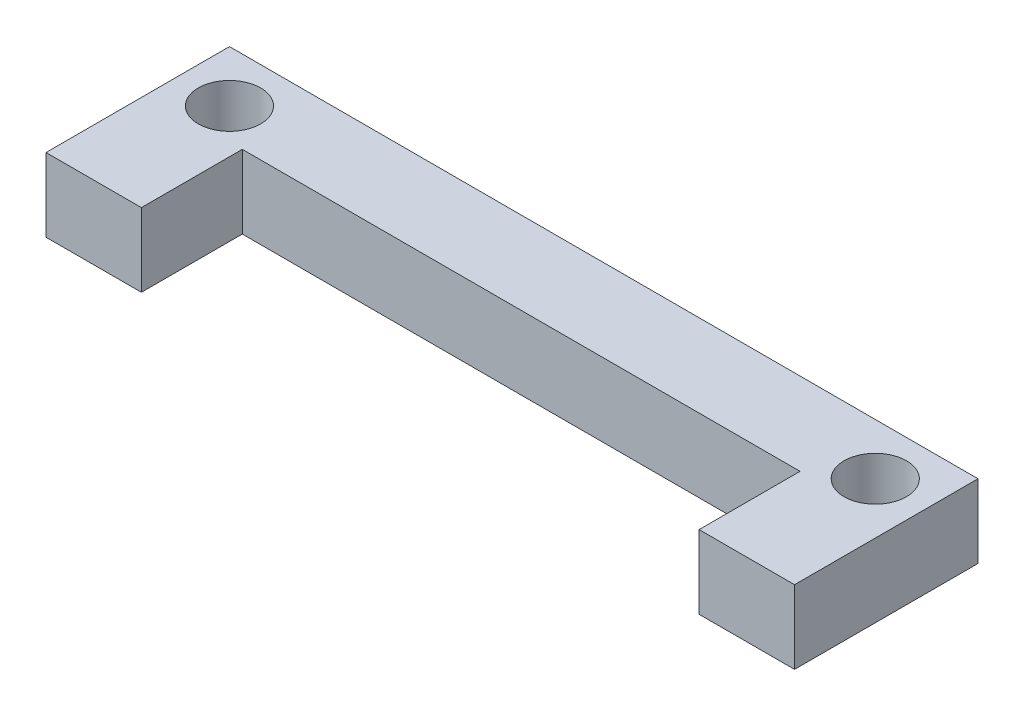
ISO-10303-21;
HEADER;
FILE_DESCRIPTION(('STEP AP214'),'2;1');
FILE_NAME('part.step','',(''),(''),'','','');
FILE_SCHEMA(('AUTOMOTIVE_DESIGN { 1 0 10303 214 1 1 1 1 }'));
ENDSEC;
DATA;
#1=APPLICATION_CONTEXT('core data for automotive mechanical design processes');
#2=APPLICATION_PROTOCOL_DEFINITION('international standard','automotive_design',2000,#1);
#3=PRODUCT_CONTEXT('',#1,'mechanical');
#4=PRODUCT('Part','Part','',(#3));
#5=PRODUCT_RELATED_PRODUCT_CATEGORY('part','',(#4));
#6=PRODUCT_DEFINITION_FORMATION('','',#4);
#7=PRODUCT_DEFINITION_CONTEXT('part definition',#1,'design');
#8=PRODUCT_DEFINITION('design','',#6,#7);
#9=PRODUCT_DEFINITION_SHAPE('','',#8);
#10=(LENGTH_UNIT() NAMED_UNIT(*) SI_UNIT(.MILLI.,.METRE.));
#11=(NAMED_UNIT(*) PLANE_ANGLE_UNIT() SI_UNIT($,.RADIAN.));
#12=(NAMED_UNIT(*) SI_UNIT($,.STERADIAN.) SOLID_ANGLE_UNIT());
#13=UNCERTAINTY_MEASURE_WITH_UNIT(LENGTH_MEASURE(1.E-05),#10,'distance_accuracy_value','');
#14=(GEOMETRIC_REPRESENTATION_CONTEXT(3) GLOBAL_UNCERTAINTY_ASSIGNED_CONTEXT((#13)) GLOBAL_UNIT_ASSIGNED_CONTEXT((#10,
#11,#12)) REPRESENTATION_CONTEXT('',''));
#15=CARTESIAN_POINT('',(0.,0.,0.));
#16=DIRECTION('',(0.,0.,1.));
#17=DIRECTION('',(1.,0.,0.));
#18=AXIS2_PLACEMENT_3D('',#15,#16,#17);
#19=CARTESIAN_POINT('',(0.,10.,0.));
#20=DIRECTION('',(0.,1.,0.));
#21=DIRECTION('',(0.,0.,1.));
#22=AXIS2_PLACEMENT_3D('',#19,#20,#21);
#23=PLANE('',#22);
#24=CARTESIAN_POINT('',(-44.,10.,-4.25000000000001));
#25=DIRECTION('',(0.,1.,0.));
#26=DIRECTION('',(0.,0.,1.));
#27=AXIS2_PLACEMENT_3D('',#24,#25,#26);
#28=CIRCLE('',#27,4.25000000000001);
#29=CARTESIAN_POINT('',(-44.,10.,0.));
#30=VERTEX_POINT('',#29);
#31=EDGE_CURVE('E138',#30,#30,#28,.T.);
#32=ORIENTED_EDGE('',*,*,#31,.F.);
#33=EDGE_LOOP('',(#32));
#34=FACE_BOUND('',#33,.T.);
#35=DIRECTION('',(0.,0.,1.));
#36=VECTOR('',#35,1.);
#37=CARTESIAN_POINT('',(-51.,10.,-11.25));
#38=LINE('',#37,#36);
#39=CARTESIAN_POINT('',(-51.,10.,-11.25));
#40=VERTEX_POINT('',#39);
#41=CARTESIAN_POINT('',(-51.,10.,13.75));
#42=VERTEX_POINT('',#41);
#43=EDGE_CURVE('E149',#40,#42,#38,.T.);
#44=ORIENTED_EDGE('',*,*,#43,.T.);
#45=DIRECTION('',(1.,0.,0.));
#46=VECTOR('',#45,1.);
#47=CARTESIAN_POINT('',(-51.,10.,13.75));
#48=LINE('',#47,#46);
#49=CARTESIAN_POINT('',(-38.,10.,13.75));
#50=VERTEX_POINT('',#49);
#51=EDGE_CURVE('E96',#42,#50,#48,.T.);
#52=ORIENTED_EDGE('',*,*,#51,.T.);
#53=DIRECTION('',(0.,0.,-1.));
#54=VECTOR('',#53,1.);
#55=CARTESIAN_POINT('',(-38.,10.,13.75));
#56=LINE('',#55,#54);
#57=CARTESIAN_POINT('',(-38.,10.,0.));
#58=VERTEX_POINT('',#57);
#59=EDGE_CURVE('E164',#50,#58,#56,.T.);
#60=ORIENTED_EDGE('',*,*,#59,.T.);
#61=DIRECTION('',(1.,0.,0.));
#62=VECTOR('',#61,1.);
#63=CARTESIAN_POINT('',(-38.,10.,0.));
#64=LINE('',#63,#62);
#65=CARTESIAN_POINT('',(38.,10.,0.));
#66=VERTEX_POINT('',#65);
#67=EDGE_CURVE('E177',#58,#66,#64,.T.);
#68=ORIENTED_EDGE('',*,*,#67,.T.);
#69=DIRECTION('',(0.,0.,1.));
#70=VECTOR('',#69,1.);
#71=CARTESIAN_POINT('',(38.,10.,13.75));
#72=LINE('',#71,#70);
#73=CARTESIAN_POINT('',(38.,10.,13.75));
#74=VERTEX_POINT('',#73);
#75=EDGE_CURVE('E115',#66,#74,#72,.T.);
#76=ORIENTED_EDGE('',*,*,#75,.T.);
#77=DIRECTION('',(1.,0.,0.));
#78=VECTOR('',#77,1.);
#79=CARTESIAN_POINT('',(51.,10.,13.75));
#80=LINE('',#79,#78);
#81=CARTESIAN_POINT('',(51.,10.,13.75));
#82=VERTEX_POINT('',#81);
#83=EDGE_CURVE('E109',#74,#82,#80,.T.);
#84=ORIENTED_EDGE('',*,*,#83,.T.);
#85=DIRECTION('',(0.,0.,-1.));
#86=VECTOR('',#85,1.);
#87=CARTESIAN_POINT('',(51.,10.,0.));
#88=LINE('',#87,#86);
#89=CARTESIAN_POINT('',(51.,10.,-11.25));
#90=VERTEX_POINT('',#89);
#91=EDGE_CURVE('E113',#82,#90,#88,.T.);
#92=ORIENTED_EDGE('',*,*,#91,.T.);
#93=DIRECTION('',(-1.,0.,0.));
#94=VECTOR('',#93,1.);
#95=CARTESIAN_POINT('',(-51.,10.,-11.25));
#96=LINE('',#95,#94);
#97=EDGE_CURVE('E54',#90,#40,#96,.T.);
#98=ORIENTED_EDGE('',*,*,#97,.T.);
#99=EDGE_LOOP('',(#44,#52,#60,#68,#76,#84,#92,#98));
#100=FACE_BOUND('',#99,.T.);
#101=CARTESIAN_POINT('',(44.,10.,-4.25000000000001));
#102=DIRECTION('',(0.,1.,0.));
#103=DIRECTION('',(0.,0.,-1.));
#104=AXIS2_PLACEMENT_3D('',#101,#102,#103);
#105=CIRCLE('',#104,4.25000000000001);
#106=CARTESIAN_POINT('',(44.,10.,-8.50000000000001));
#107=VERTEX_POINT('',#106);
#108=EDGE_CURVE('E186',#107,#107,#105,.T.);
#109=ORIENTED_EDGE('',*,*,#108,.F.);
#110=EDGE_LOOP('',(#109));
#111=FACE_BOUND('',#110,.T.);
#112=ADVANCED_FACE('F37',(#34,#100,#111),#23,.T.);
#113=CARTESIAN_POINT('',(0.,0.,0.));
#114=DIRECTION('',(0.,1.,0.));
#115=DIRECTION('',(0.,0.,1.));
#116=AXIS2_PLACEMENT_3D('',#113,#114,#115);
#117=PLANE('',#116);
#118=DIRECTION('',(0.,0.,1.));
#119=VECTOR('',#118,1.);
#120=CARTESIAN_POINT('',(-51.,0.,-11.25));
#121=LINE('',#120,#119);
#122=CARTESIAN_POINT('',(-51.,0.,-11.25));
#123=VERTEX_POINT('',#122);
#124=CARTESIAN_POINT('',(-51.,0.,13.75));
#125=VERTEX_POINT('',#124);
#126=EDGE_CURVE('E134',#123,#125,#121,.T.);
#127=ORIENTED_EDGE('',*,*,#126,.F.);
#128=DIRECTION('',(-1.,0.,0.));
#129=VECTOR('',#128,1.);
#130=CARTESIAN_POINT('',(-51.,0.,-11.25));
#131=LINE('',#130,#129);
#132=CARTESIAN_POINT('',(51.,0.,-11.25));
#133=VERTEX_POINT('',#132);
#134=EDGE_CURVE('E88',#133,#123,#131,.T.);
#135=ORIENTED_EDGE('',*,*,#134,.F.);
#136=DIRECTION('',(0.,0.,-1.));
#137=VECTOR('',#136,1.);
#138=CARTESIAN_POINT('',(51.,0.,-11.25));
#139=LINE('',#138,#137);
#140=CARTESIAN_POINT('',(51.,0.,13.75));
#141=VERTEX_POINT('',#140);
#142=EDGE_CURVE('E82',#141,#133,#139,.T.);
#143=ORIENTED_EDGE('',*,*,#142,.F.);
#144=DIRECTION('',(1.,0.,0.));
#145=VECTOR('',#144,1.);
#146=CARTESIAN_POINT('',(51.,0.,13.75));
#147=LINE('',#146,#145);
#148=CARTESIAN_POINT('',(38.,0.,13.75));
#149=VERTEX_POINT('',#148);
#150=EDGE_CURVE('E124',#149,#141,#147,.T.);
#151=ORIENTED_EDGE('',*,*,#150,.F.);
#152=DIRECTION('',(0.,0.,1.));
#153=VECTOR('',#152,1.);
#154=CARTESIAN_POINT('',(38.,0.,13.75));
#155=LINE('',#154,#153);
#156=CARTESIAN_POINT('',(38.,0.,0.));
#157=VERTEX_POINT('',#156);
#158=EDGE_CURVE('E144',#157,#149,#155,.T.);
#159=ORIENTED_EDGE('',*,*,#158,.F.);
#160=DIRECTION('',(1.,0.,0.));
#161=VECTOR('',#160,1.);
#162=CARTESIAN_POINT('',(-38.,0.,0.));
#163=LINE('',#162,#161);
#164=CARTESIAN_POINT('',(-38.,0.,0.));
#165=VERTEX_POINT('',#164);
#166=EDGE_CURVE('E142',#165,#157,#163,.T.);
#167=ORIENTED_EDGE('',*,*,#166,.F.);
#168=DIRECTION('',(0.,0.,-1.));
#169=VECTOR('',#168,1.);
#170=CARTESIAN_POINT('',(-38.,0.,13.75));
#171=LINE('',#170,#169);
#172=CARTESIAN_POINT('',(-38.,0.,13.75));
#173=VERTEX_POINT('',#172);
#174=EDGE_CURVE('E140',#173,#165,#171,.T.);
#175=ORIENTED_EDGE('',*,*,#174,.F.);
#176=DIRECTION('',(1.,0.,0.));
#177=VECTOR('',#176,1.);
#178=CARTESIAN_POINT('',(-51.,0.,13.75));
#179=LINE('',#178,#177);
#180=EDGE_CURVE('E137',#125,#173,#179,.T.);
#181=ORIENTED_EDGE('',*,*,#180,.F.);
#182=EDGE_LOOP('',(#127,#135,#143,#151,#159,#167,#175,#181));
#183=FACE_BOUND('',#182,.T.);
#184=CARTESIAN_POINT('',(-44.,0.,-4.25000000000001));
#185=DIRECTION('',(0.,1.,0.));
#186=DIRECTION('',(0.,0.,1.));
#187=AXIS2_PLACEMENT_3D('',#184,#185,#186);
#188=CIRCLE('',#187,4.25000000000001);
#189=CARTESIAN_POINT('',(-44.,0.,0.));
#190=VERTEX_POINT('',#189);
#191=EDGE_CURVE('E183',#190,#190,#188,.T.);
#192=ORIENTED_EDGE('',*,*,#191,.T.);
#193=EDGE_LOOP('',(#192));
#194=FACE_BOUND('',#193,.T.);
#195=CARTESIAN_POINT('',(44.,0.,-4.25000000000001));
#196=DIRECTION('',(0.,1.,0.));
#197=DIRECTION('',(0.,0.,-1.));
#198=AXIS2_PLACEMENT_3D('',#195,#196,#197);
#199=CIRCLE('',#198,4.25000000000001);
#200=CARTESIAN_POINT('',(44.,0.,-8.50000000000001));
#201=VERTEX_POINT('',#200);
#202=EDGE_CURVE('E189',#201,#201,#199,.T.);
#203=ORIENTED_EDGE('',*,*,#202,.T.);
#204=EDGE_LOOP('',(#203));
#205=FACE_BOUND('',#204,.T.);
#206=ADVANCED_FACE('F168',(#183,#194,#205),#117,.F.);
#207=CARTESIAN_POINT('',(-51.,10.,-11.25));
#208=DIRECTION('',(1.,0.,0.));
#209=DIRECTION('',(0.,0.,-1.));
#210=AXIS2_PLACEMENT_3D('',#207,#208,#209);
#211=PLANE('',#210);
#212=ORIENTED_EDGE('',*,*,#126,.T.);
#213=DIRECTION('',(0.,-1.,0.));
#214=VECTOR('',#213,1.);
#215=CARTESIAN_POINT('',(-51.,10.,13.75));
#216=LINE('',#215,#214);
#217=EDGE_CURVE('E11',#42,#125,#216,.T.);
#218=ORIENTED_EDGE('',*,*,#217,.F.);
#219=ORIENTED_EDGE('',*,*,#43,.F.);
#220=DIRECTION('',(0.,-1.,0.));
#221=VECTOR('',#220,1.);
#222=CARTESIAN_POINT('',(-51.,10.,-11.25));
#223=LINE('',#222,#221);
#224=EDGE_CURVE('E130',#40,#123,#223,.T.);
#225=ORIENTED_EDGE('',*,*,#224,.T.);
#226=EDGE_LOOP('',(#212,#218,#219,#225));
#227=FACE_BOUND('',#226,.T.);
#228=ADVANCED_FACE('F39',(#227),#211,.F.);
#229=CARTESIAN_POINT('',(-51.,10.,13.75));
#230=DIRECTION('',(0.,0.,-1.));
#231=DIRECTION('',(-1.,0.,0.));
#232=AXIS2_PLACEMENT_3D('',#229,#230,#231);
#233=PLANE('',#232);
#234=ORIENTED_EDGE('',*,*,#180,.T.);
#235=DIRECTION('',(0.,-1.,0.));
#236=VECTOR('',#235,1.);
#237=CARTESIAN_POINT('',(-38.,10.,13.75));
#238=LINE('',#237,#236);
#239=EDGE_CURVE('E46',#50,#173,#238,.T.);
#240=ORIENTED_EDGE('',*,*,#239,.F.);
#241=ORIENTED_EDGE('',*,*,#51,.F.);
#242=ORIENTED_EDGE('',*,*,#217,.T.);
#243=EDGE_LOOP('',(#234,#240,#241,#242));
#244=FACE_BOUND('',#243,.T.);
#245=ADVANCED_FACE('F221',(#244),#233,.F.);
#246=CARTESIAN_POINT('',(-38.,10.,13.75));
#247=DIRECTION('',(-1.,0.,0.));
#248=DIRECTION('',(0.,0.,1.));
#249=AXIS2_PLACEMENT_3D('',#246,#247,#248);
#250=PLANE('',#249);
#251=ORIENTED_EDGE('',*,*,#174,.T.);
#252=DIRECTION('',(0.,-1.,0.));
#253=VECTOR('',#252,1.);
#254=CARTESIAN_POINT('',(-38.,10.,0.));
#255=LINE('',#254,#253);
#256=EDGE_CURVE('E156',#58,#165,#255,.T.);
#257=ORIENTED_EDGE('',*,*,#256,.F.);
#258=ORIENTED_EDGE('',*,*,#59,.F.);
#259=ORIENTED_EDGE('',*,*,#239,.T.);
#260=EDGE_LOOP('',(#251,#257,#258,#259));
#261=FACE_BOUND('',#260,.T.);
#262=ADVANCED_FACE('F162',(#261),#250,.F.);
#263=CARTESIAN_POINT('',(-38.,10.,0.));
#264=DIRECTION('',(0.,0.,-1.));
#265=DIRECTION('',(-1.,0.,0.));
#266=AXIS2_PLACEMENT_3D('',#263,#264,#265);
#267=PLANE('',#266);
#268=ORIENTED_EDGE('',*,*,#166,.T.);
#269=DIRECTION('',(0.,-1.,0.));
#270=VECTOR('',#269,1.);
#271=CARTESIAN_POINT('',(38.,10.,0.));
#272=LINE('',#271,#270);
#273=EDGE_CURVE('E153',#66,#157,#272,.T.);
#274=ORIENTED_EDGE('',*,*,#273,.F.);
#275=ORIENTED_EDGE('',*,*,#67,.F.);
#276=ORIENTED_EDGE('',*,*,#256,.T.);
#277=EDGE_LOOP('',(#268,#274,#275,#276));
#278=FACE_BOUND('',#277,.T.);
#279=ADVANCED_FACE('F173',(#278),#267,.F.);
#280=CARTESIAN_POINT('',(38.,10.,13.75));
#281=DIRECTION('',(1.,0.,0.));
#282=DIRECTION('',(0.,0.,-1.));
#283=AXIS2_PLACEMENT_3D('',#280,#281,#282);
#284=PLANE('',#283);
#285=ORIENTED_EDGE('',*,*,#158,.T.);
#286=DIRECTION('',(0.,-1.,0.));
#287=VECTOR('',#286,1.);
#288=CARTESIAN_POINT('',(38.,10.,13.75));
#289=LINE('',#288,#287);
#290=EDGE_CURVE('E125',#74,#149,#289,.T.);
#291=ORIENTED_EDGE('',*,*,#290,.F.);
#292=ORIENTED_EDGE('',*,*,#75,.F.);
#293=ORIENTED_EDGE('',*,*,#273,.T.);
#294=EDGE_LOOP('',(#285,#291,#292,#293));
#295=FACE_BOUND('',#294,.T.);
#296=ADVANCED_FACE('F176',(#295),#284,.F.);
#297=CARTESIAN_POINT('',(51.,10.,13.75));
#298=DIRECTION('',(0.,0.,-1.));
#299=DIRECTION('',(-1.,0.,0.));
#300=AXIS2_PLACEMENT_3D('',#297,#298,#299);
#301=PLANE('',#300);
#302=ORIENTED_EDGE('',*,*,#150,.T.);
#303=DIRECTION('',(0.,-1.,0.));
#304=VECTOR('',#303,1.);
#305=CARTESIAN_POINT('',(51.,10.,13.75));
#306=LINE('',#305,#304);
#307=EDGE_CURVE('E121',#82,#141,#306,.T.);
#308=ORIENTED_EDGE('',*,*,#307,.F.);
#309=ORIENTED_EDGE('',*,*,#83,.F.);
#310=ORIENTED_EDGE('',*,*,#290,.T.);
#311=EDGE_LOOP('',(#302,#308,#309,#310));
#312=FACE_BOUND('',#311,.T.);
#313=ADVANCED_FACE('F122',(#312),#301,.F.);
#314=CARTESIAN_POINT('',(51.,10.,-11.25));
#315=DIRECTION('',(-1.,0.,0.));
#316=DIRECTION('',(0.,0.,1.));
#317=AXIS2_PLACEMENT_3D('',#314,#315,#316);
#318=PLANE('',#317);
#319=ORIENTED_EDGE('',*,*,#142,.T.);
#320=DIRECTION('',(0.,-1.,0.));
#321=VECTOR('',#320,1.);
#322=CARTESIAN_POINT('',(51.,10.,-11.25));
#323=LINE('',#322,#321);
#324=EDGE_CURVE('E126',#90,#133,#323,.T.);
#325=ORIENTED_EDGE('',*,*,#324,.F.);
#326=ORIENTED_EDGE('',*,*,#91,.F.);
#327=ORIENTED_EDGE('',*,*,#307,.T.);
#328=EDGE_LOOP('',(#319,#325,#326,#327));
#329=FACE_BOUND('',#328,.T.);
#330=ADVANCED_FACE('F128',(#329),#318,.F.);
#331=CARTESIAN_POINT('',(-51.,10.,-11.25));
#332=DIRECTION('',(0.,0.,1.));
#333=DIRECTION('',(1.,0.,0.));
#334=AXIS2_PLACEMENT_3D('',#331,#332,#333);
#335=PLANE('',#334);
#336=ORIENTED_EDGE('',*,*,#134,.T.);
#337=ORIENTED_EDGE('',*,*,#224,.F.);
#338=ORIENTED_EDGE('',*,*,#97,.F.);
#339=ORIENTED_EDGE('',*,*,#324,.T.);
#340=EDGE_LOOP('',(#336,#337,#338,#339));
#341=FACE_BOUND('',#340,.T.);
#342=ADVANCED_FACE('F209',(#341),#335,.F.);
#343=CARTESIAN_POINT('',(-44.,10.,-4.25000000000001));
#344=DIRECTION('',(0.,-1.,0.));
#345=DIRECTION('',(0.,0.,-1.));
#346=AXIS2_PLACEMENT_3D('',#343,#344,#345);
#347=CYLINDRICAL_SURFACE('',#346,4.25000000000001);
#348=ORIENTED_EDGE('',*,*,#31,.T.);
#349=EDGE_LOOP('',(#348));
#350=FACE_BOUND('',#349,.T.);
#351=ORIENTED_EDGE('',*,*,#191,.F.);
#352=EDGE_LOOP('',(#351));
#353=FACE_BOUND('',#352,.T.);
#354=ADVANCED_FACE('F206',(#350,#353),#347,.F.);
#355=CARTESIAN_POINT('',(44.,10.,-4.25000000000001));
#356=DIRECTION('',(0.,-1.,0.));
#357=DIRECTION('',(0.,0.,-1.));
#358=AXIS2_PLACEMENT_3D('',#355,#356,#357);
#359=CYLINDRICAL_SURFACE('',#358,4.25000000000001);
#360=ORIENTED_EDGE('',*,*,#108,.T.);
#361=EDGE_LOOP('',(#360));
#362=FACE_BOUND('',#361,.T.);
#363=ORIENTED_EDGE('',*,*,#202,.F.);
#364=EDGE_LOOP('',(#363));
#365=FACE_BOUND('',#364,.T.);
#366=ADVANCED_FACE('F195',(#362,#365),#359,.F.);
#367=CLOSED_SHELL('',(#112,#206,#228,#245,#262,#279,#296,#313,#330,#342,#354,#366));
#368=MANIFOLD_SOLID_BREP('B2',#367);
#369=ADVANCED_BREP_SHAPE_REPRESENTATION('',(#18,#368),#14);
#370=SHAPE_DEFINITION_REPRESENTATION(#9,#369);
ENDSEC;
END-ISO-10303-21;
